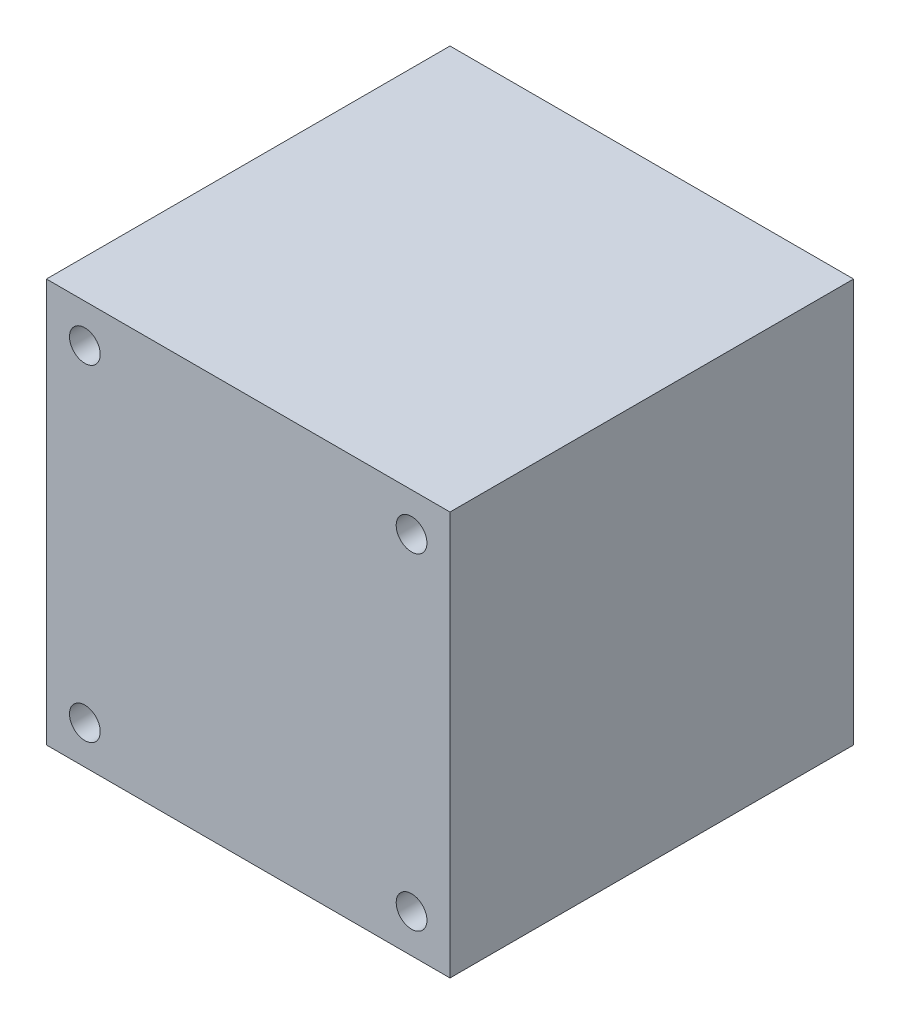
ISO-10303-21;
HEADER;
FILE_DESCRIPTION(('STEP AP214'),'2;1');
FILE_NAME('part.step','',(''),(''),'','','');
FILE_SCHEMA(('AUTOMOTIVE_DESIGN { 1 0 10303 214 1 1 1 1 }'));
ENDSEC;
DATA;
#1=APPLICATION_CONTEXT('core data for automotive mechanical design processes');
#2=APPLICATION_PROTOCOL_DEFINITION('international standard','automotive_design',2000,#1);
#3=PRODUCT_CONTEXT('',#1,'mechanical');
#4=PRODUCT('Part','Part','',(#3));
#5=PRODUCT_RELATED_PRODUCT_CATEGORY('part','',(#4));
#6=PRODUCT_DEFINITION_FORMATION('','',#4);
#7=PRODUCT_DEFINITION_CONTEXT('part definition',#1,'design');
#8=PRODUCT_DEFINITION('design','',#6,#7);
#9=PRODUCT_DEFINITION_SHAPE('','',#8);
#10=(LENGTH_UNIT() NAMED_UNIT(*) SI_UNIT(.MILLI.,.METRE.));
#11=(NAMED_UNIT(*) PLANE_ANGLE_UNIT() SI_UNIT($,.RADIAN.));
#12=(NAMED_UNIT(*) SI_UNIT($,.STERADIAN.) SOLID_ANGLE_UNIT());
#13=UNCERTAINTY_MEASURE_WITH_UNIT(LENGTH_MEASURE(1.E-05),#10,'distance_accuracy_value','');
#14=(GEOMETRIC_REPRESENTATION_CONTEXT(3) GLOBAL_UNCERTAINTY_ASSIGNED_CONTEXT((#13)) GLOBAL_UNIT_ASSIGNED_CONTEXT((#10,
#11,#12)) REPRESENTATION_CONTEXT('',''));
#15=CARTESIAN_POINT('',(0.,0.,0.));
#16=DIRECTION('',(0.,0.,1.));
#17=DIRECTION('',(1.,0.,0.));
#18=AXIS2_PLACEMENT_3D('',#15,#16,#17);
#19=CARTESIAN_POINT('',(0.,0.,42.));
#20=DIRECTION('',(0.,0.,-1.));
#21=DIRECTION('',(-1.,0.,0.));
#22=AXIS2_PLACEMENT_3D('',#19,#20,#21);
#23=PLANE('',#22);
#24=DIRECTION('',(0.,1.,0.));
#25=VECTOR('',#24,1.);
#26=CARTESIAN_POINT('',(21.,-21.,42.));
#27=LINE('',#26,#25);
#28=CARTESIAN_POINT('',(21.,-21.,42.));
#29=VERTEX_POINT('',#28);
#30=CARTESIAN_POINT('',(21.,21.,42.));
#31=VERTEX_POINT('',#30);
#32=EDGE_CURVE('E85',#29,#31,#27,.T.);
#33=ORIENTED_EDGE('',*,*,#32,.T.);
#34=DIRECTION('',(-1.,0.,0.));
#35=VECTOR('',#34,1.);
#36=CARTESIAN_POINT('',(-21.,21.,42.));
#37=LINE('',#36,#35);
#38=CARTESIAN_POINT('',(-21.,21.,42.));
#39=VERTEX_POINT('',#38);
#40=EDGE_CURVE('E80',#31,#39,#37,.T.);
#41=ORIENTED_EDGE('',*,*,#40,.T.);
#42=DIRECTION('',(0.,-1.,0.));
#43=VECTOR('',#42,1.);
#44=CARTESIAN_POINT('',(-21.,-21.,42.));
#45=LINE('',#44,#43);
#46=CARTESIAN_POINT('',(-21.,-21.,42.));
#47=VERTEX_POINT('',#46);
#48=EDGE_CURVE('E83',#39,#47,#45,.T.);
#49=ORIENTED_EDGE('',*,*,#48,.T.);
#50=DIRECTION('',(1.,0.,0.));
#51=VECTOR('',#50,1.);
#52=CARTESIAN_POINT('',(-21.,-21.,42.));
#53=LINE('',#52,#51);
#54=EDGE_CURVE('E50',#47,#29,#53,.T.);
#55=ORIENTED_EDGE('',*,*,#54,.T.);
#56=EDGE_LOOP('',(#33,#41,#49,#55));
#57=FACE_BOUND('',#56,.T.);
#58=CARTESIAN_POINT('',(-17.,17.,42.));
#59=DIRECTION('',(0.,0.,1.));
#60=DIRECTION('',(1.,0.,0.));
#61=AXIS2_PLACEMENT_3D('',#58,#59,#60);
#62=CIRCLE('',#61,1.6);
#63=CARTESIAN_POINT('',(-18.6,17.,42.));
#64=VERTEX_POINT('',#63);
#65=EDGE_CURVE('E100',#64,#64,#62,.T.);
#66=ORIENTED_EDGE('',*,*,#65,.F.);
#67=EDGE_LOOP('',(#66));
#68=FACE_BOUND('',#67,.T.);
#69=CARTESIAN_POINT('',(-17.,-17.,42.));
#70=DIRECTION('',(0.,0.,1.));
#71=DIRECTION('',(1.,0.,0.));
#72=AXIS2_PLACEMENT_3D('',#69,#70,#71);
#73=CIRCLE('',#72,1.6);
#74=CARTESIAN_POINT('',(-18.6,-17.,42.));
#75=VERTEX_POINT('',#74);
#76=EDGE_CURVE('E115',#75,#75,#73,.T.);
#77=ORIENTED_EDGE('',*,*,#76,.F.);
#78=EDGE_LOOP('',(#77));
#79=FACE_BOUND('',#78,.T.);
#80=CARTESIAN_POINT('',(17.,-17.,42.));
#81=DIRECTION('',(0.,0.,1.));
#82=DIRECTION('',(1.,0.,0.));
#83=AXIS2_PLACEMENT_3D('',#80,#81,#82);
#84=CIRCLE('',#83,1.6);
#85=CARTESIAN_POINT('',(15.4,-17.,42.));
#86=VERTEX_POINT('',#85);
#87=EDGE_CURVE('E121',#86,#86,#84,.T.);
#88=ORIENTED_EDGE('',*,*,#87,.F.);
#89=EDGE_LOOP('',(#88));
#90=FACE_BOUND('',#89,.T.);
#91=CARTESIAN_POINT('',(17.,17.,42.));
#92=DIRECTION('',(0.,0.,1.));
#93=DIRECTION('',(1.,0.,0.));
#94=AXIS2_PLACEMENT_3D('',#91,#92,#93);
#95=CIRCLE('',#94,1.6);
#96=CARTESIAN_POINT('',(15.4,17.,42.));
#97=VERTEX_POINT('',#96);
#98=EDGE_CURVE('E127',#97,#97,#95,.T.);
#99=ORIENTED_EDGE('',*,*,#98,.F.);
#100=EDGE_LOOP('',(#99));
#101=FACE_BOUND('',#100,.T.);
#102=ADVANCED_FACE('F33',(#57,#68,#79,#90,#101),#23,.F.);
#103=CARTESIAN_POINT('',(0.,0.,0.));
#104=DIRECTION('',(0.,0.,-1.));
#105=DIRECTION('',(-1.,0.,0.));
#106=AXIS2_PLACEMENT_3D('',#103,#104,#105);
#107=PLANE('',#106);
#108=CARTESIAN_POINT('',(17.,-17.,0.));
#109=DIRECTION('',(0.,0.,1.));
#110=DIRECTION('',(1.,0.,0.));
#111=AXIS2_PLACEMENT_3D('',#108,#109,#110);
#112=CIRCLE('',#111,1.6);
#113=CARTESIAN_POINT('',(15.4,-17.,0.));
#114=VERTEX_POINT('',#113);
#115=EDGE_CURVE('E124',#114,#114,#112,.T.);
#116=ORIENTED_EDGE('',*,*,#115,.T.);
#117=EDGE_LOOP('',(#116));
#118=FACE_BOUND('',#117,.T.);
#119=CARTESIAN_POINT('',(-17.,17.,0.));
#120=DIRECTION('',(0.,0.,1.));
#121=DIRECTION('',(1.,0.,0.));
#122=AXIS2_PLACEMENT_3D('',#119,#120,#121);
#123=CIRCLE('',#122,1.6);
#124=CARTESIAN_POINT('',(-18.6,17.,0.));
#125=VERTEX_POINT('',#124);
#126=EDGE_CURVE('E112',#125,#125,#123,.T.);
#127=ORIENTED_EDGE('',*,*,#126,.T.);
#128=EDGE_LOOP('',(#127));
#129=FACE_BOUND('',#128,.T.);
#130=DIRECTION('',(0.,1.,0.));
#131=VECTOR('',#130,1.);
#132=CARTESIAN_POINT('',(21.,-21.,0.));
#133=LINE('',#132,#131);
#134=CARTESIAN_POINT('',(21.,-21.,0.));
#135=VERTEX_POINT('',#134);
#136=CARTESIAN_POINT('',(21.,21.,0.));
#137=VERTEX_POINT('',#136);
#138=EDGE_CURVE('E97',#135,#137,#133,.T.);
#139=ORIENTED_EDGE('',*,*,#138,.F.);
#140=DIRECTION('',(1.,0.,0.));
#141=VECTOR('',#140,1.);
#142=CARTESIAN_POINT('',(-21.,-21.,0.));
#143=LINE('',#142,#141);
#144=CARTESIAN_POINT('',(-21.,-21.,0.));
#145=VERTEX_POINT('',#144);
#146=EDGE_CURVE('E73',#145,#135,#143,.T.);
#147=ORIENTED_EDGE('',*,*,#146,.F.);
#148=DIRECTION('',(0.,-1.,0.));
#149=VECTOR('',#148,1.);
#150=CARTESIAN_POINT('',(-21.,-21.,0.));
#151=LINE('',#150,#149);
#152=CARTESIAN_POINT('',(-21.,21.,0.));
#153=VERTEX_POINT('',#152);
#154=EDGE_CURVE('E67',#153,#145,#151,.T.);
#155=ORIENTED_EDGE('',*,*,#154,.F.);
#156=DIRECTION('',(-1.,0.,0.));
#157=VECTOR('',#156,1.);
#158=CARTESIAN_POINT('',(-21.,21.,0.));
#159=LINE('',#158,#157);
#160=EDGE_CURVE('E89',#137,#153,#159,.T.);
#161=ORIENTED_EDGE('',*,*,#160,.F.);
#162=EDGE_LOOP('',(#139,#147,#155,#161));
#163=FACE_BOUND('',#162,.T.);
#164=CARTESIAN_POINT('',(-17.,-17.,0.));
#165=DIRECTION('',(0.,0.,1.));
#166=DIRECTION('',(1.,0.,0.));
#167=AXIS2_PLACEMENT_3D('',#164,#165,#166);
#168=CIRCLE('',#167,1.6);
#169=CARTESIAN_POINT('',(-18.6,-17.,0.));
#170=VERTEX_POINT('',#169);
#171=EDGE_CURVE('E118',#170,#170,#168,.T.);
#172=ORIENTED_EDGE('',*,*,#171,.T.);
#173=EDGE_LOOP('',(#172));
#174=FACE_BOUND('',#173,.T.);
#175=CARTESIAN_POINT('',(17.,17.,0.));
#176=DIRECTION('',(0.,0.,1.));
#177=DIRECTION('',(1.,0.,0.));
#178=AXIS2_PLACEMENT_3D('',#175,#176,#177);
#179=CIRCLE('',#178,1.6);
#180=CARTESIAN_POINT('',(15.4,17.,0.));
#181=VERTEX_POINT('',#180);
#182=EDGE_CURVE('E130',#181,#181,#179,.T.);
#183=ORIENTED_EDGE('',*,*,#182,.T.);
#184=EDGE_LOOP('',(#183));
#185=FACE_BOUND('',#184,.T.);
#186=ADVANCED_FACE('F108',(#118,#129,#163,#174,#185),#107,.T.);
#187=CARTESIAN_POINT('',(21.,-21.,42.));
#188=DIRECTION('',(-1.,0.,0.));
#189=DIRECTION('',(0.,-1.,0.));
#190=AXIS2_PLACEMENT_3D('',#187,#188,#189);
#191=PLANE('',#190);
#192=ORIENTED_EDGE('',*,*,#138,.T.);
#193=DIRECTION('',(0.,0.,-1.));
#194=VECTOR('',#193,1.);
#195=CARTESIAN_POINT('',(21.,21.,42.));
#196=LINE('',#195,#194);
#197=EDGE_CURVE('E11',#31,#137,#196,.T.);
#198=ORIENTED_EDGE('',*,*,#197,.F.);
#199=ORIENTED_EDGE('',*,*,#32,.F.);
#200=DIRECTION('',(0.,0.,-1.));
#201=VECTOR('',#200,1.);
#202=CARTESIAN_POINT('',(21.,-21.,42.));
#203=LINE('',#202,#201);
#204=EDGE_CURVE('E93',#29,#135,#203,.T.);
#205=ORIENTED_EDGE('',*,*,#204,.T.);
#206=EDGE_LOOP('',(#192,#198,#199,#205));
#207=FACE_BOUND('',#206,.T.);
#208=ADVANCED_FACE('F35',(#207),#191,.F.);
#209=CARTESIAN_POINT('',(-21.,21.,42.));
#210=DIRECTION('',(0.,-1.,0.));
#211=DIRECTION('',(0.,0.,-1.));
#212=AXIS2_PLACEMENT_3D('',#209,#210,#211);
#213=PLANE('',#212);
#214=ORIENTED_EDGE('',*,*,#160,.T.);
#215=DIRECTION('',(0.,0.,-1.));
#216=VECTOR('',#215,1.);
#217=CARTESIAN_POINT('',(-21.,21.,42.));
#218=LINE('',#217,#216);
#219=EDGE_CURVE('E42',#39,#153,#218,.T.);
#220=ORIENTED_EDGE('',*,*,#219,.F.);
#221=ORIENTED_EDGE('',*,*,#40,.F.);
#222=ORIENTED_EDGE('',*,*,#197,.T.);
#223=EDGE_LOOP('',(#214,#220,#221,#222));
#224=FACE_BOUND('',#223,.T.);
#225=ADVANCED_FACE('F88',(#224),#213,.F.);
#226=CARTESIAN_POINT('',(-21.,-21.,42.));
#227=DIRECTION('',(1.,0.,0.));
#228=DIRECTION('',(0.,0.,-1.));
#229=AXIS2_PLACEMENT_3D('',#226,#227,#228);
#230=PLANE('',#229);
#231=ORIENTED_EDGE('',*,*,#154,.T.);
#232=DIRECTION('',(0.,0.,-1.));
#233=VECTOR('',#232,1.);
#234=CARTESIAN_POINT('',(-21.,-21.,42.));
#235=LINE('',#234,#233);
#236=EDGE_CURVE('E90',#47,#145,#235,.T.);
#237=ORIENTED_EDGE('',*,*,#236,.F.);
#238=ORIENTED_EDGE('',*,*,#48,.F.);
#239=ORIENTED_EDGE('',*,*,#219,.T.);
#240=EDGE_LOOP('',(#231,#237,#238,#239));
#241=FACE_BOUND('',#240,.T.);
#242=ADVANCED_FACE('F91',(#241),#230,.F.);
#243=CARTESIAN_POINT('',(-21.,-21.,42.));
#244=DIRECTION('',(0.,1.,0.));
#245=DIRECTION('',(-1.,0.,0.));
#246=AXIS2_PLACEMENT_3D('',#243,#244,#245);
#247=PLANE('',#246);
#248=ORIENTED_EDGE('',*,*,#146,.T.);
#249=ORIENTED_EDGE('',*,*,#204,.F.);
#250=ORIENTED_EDGE('',*,*,#54,.F.);
#251=ORIENTED_EDGE('',*,*,#236,.T.);
#252=EDGE_LOOP('',(#248,#249,#250,#251));
#253=FACE_BOUND('',#252,.T.);
#254=ADVANCED_FACE('F105',(#253),#247,.F.);
#255=CARTESIAN_POINT('',(-17.,17.,42.));
#256=DIRECTION('',(0.,0.,-1.));
#257=DIRECTION('',(-1.,0.,0.));
#258=AXIS2_PLACEMENT_3D('',#255,#256,#257);
#259=CYLINDRICAL_SURFACE('',#258,1.6);
#260=CARTESIAN_POINT('',(-18.6,17.,42.));
#261=CARTESIAN_POINT('',(-18.6,17.,41.5625));
#262=CARTESIAN_POINT('',(-18.6,17.,41.125));
#263=CARTESIAN_POINT('',(-18.6,17.,40.25));
#264=CARTESIAN_POINT('',(-18.6,17.,39.8125));
#265=CARTESIAN_POINT('',(-18.6,17.,38.9375));
#266=CARTESIAN_POINT('',(-18.6,17.,38.5));
#267=CARTESIAN_POINT('',(-18.6,17.,37.625));
#268=CARTESIAN_POINT('',(-18.6,17.,37.1875));
#269=CARTESIAN_POINT('',(-18.6,17.,36.3125));
#270=CARTESIAN_POINT('',(-18.6,17.,35.875));
#271=CARTESIAN_POINT('',(-18.6,17.,35.));
#272=CARTESIAN_POINT('',(-18.6,17.,34.5625));
#273=CARTESIAN_POINT('',(-18.6,17.,33.6875));
#274=CARTESIAN_POINT('',(-18.6,17.,33.25));
#275=CARTESIAN_POINT('',(-18.6,17.,32.375));
#276=CARTESIAN_POINT('',(-18.6,17.,31.9375));
#277=CARTESIAN_POINT('',(-18.6,17.,31.0625));
#278=CARTESIAN_POINT('',(-18.6,17.,30.625));
#279=CARTESIAN_POINT('',(-18.6,17.,29.75));
#280=CARTESIAN_POINT('',(-18.6,17.,29.3125));
#281=CARTESIAN_POINT('',(-18.6,17.,28.4375));
#282=CARTESIAN_POINT('',(-18.6,17.,28.));
#283=CARTESIAN_POINT('',(-18.6,17.,27.125));
#284=CARTESIAN_POINT('',(-18.6,17.,26.6875));
#285=CARTESIAN_POINT('',(-18.6,17.,25.8125));
#286=CARTESIAN_POINT('',(-18.6,17.,25.375));
#287=CARTESIAN_POINT('',(-18.6,17.,24.5));
#288=CARTESIAN_POINT('',(-18.6,17.,24.0625));
#289=CARTESIAN_POINT('',(-18.6,17.,23.1875));
#290=CARTESIAN_POINT('',(-18.6,17.,22.75));
#291=CARTESIAN_POINT('',(-18.6,17.,21.875));
#292=CARTESIAN_POINT('',(-18.6,17.,21.4375));
#293=CARTESIAN_POINT('',(-18.6,17.,20.5625));
#294=CARTESIAN_POINT('',(-18.6,17.,20.125));
#295=CARTESIAN_POINT('',(-18.6,17.,19.25));
#296=CARTESIAN_POINT('',(-18.6,17.,18.8125));
#297=CARTESIAN_POINT('',(-18.6,17.,17.9375));
#298=CARTESIAN_POINT('',(-18.6,17.,17.5));
#299=CARTESIAN_POINT('',(-18.6,17.,16.625));
#300=CARTESIAN_POINT('',(-18.6,17.,16.1875));
#301=CARTESIAN_POINT('',(-18.6,17.,15.3125));
#302=CARTESIAN_POINT('',(-18.6,17.,14.875));
#303=CARTESIAN_POINT('',(-18.6,17.,14.));
#304=CARTESIAN_POINT('',(-18.6,17.,13.5625));
#305=CARTESIAN_POINT('',(-18.6,17.,12.6875));
#306=CARTESIAN_POINT('',(-18.6,17.,12.25));
#307=CARTESIAN_POINT('',(-18.6,17.,11.375));
#308=CARTESIAN_POINT('',(-18.6,17.,10.9375));
#309=CARTESIAN_POINT('',(-18.6,17.,10.0625));
#310=CARTESIAN_POINT('',(-18.6,17.,9.625));
#311=CARTESIAN_POINT('',(-18.6,17.,8.75));
#312=CARTESIAN_POINT('',(-18.6,17.,8.3125));
#313=CARTESIAN_POINT('',(-18.6,17.,7.4375));
#314=CARTESIAN_POINT('',(-18.6,17.,7.));
#315=CARTESIAN_POINT('',(-18.6,17.,6.125));
#316=CARTESIAN_POINT('',(-18.6,17.,5.6875));
#317=CARTESIAN_POINT('',(-18.6,17.,4.8125));
#318=CARTESIAN_POINT('',(-18.6,17.,4.375));
#319=CARTESIAN_POINT('',(-18.6,17.,3.5));
#320=CARTESIAN_POINT('',(-18.6,17.,3.0625));
#321=CARTESIAN_POINT('',(-18.6,17.,2.1875));
#322=CARTESIAN_POINT('',(-18.6,17.,1.75));
#323=CARTESIAN_POINT('',(-18.6,17.,0.875000000000001));
#324=CARTESIAN_POINT('',(-18.6,17.,0.4375));
#325=CARTESIAN_POINT('',(-18.6,17.,0.));
#326=B_SPLINE_CURVE_WITH_KNOTS('',3,(#260,#261,#262,#263,#264,#265,#266,#267,#268,#269,#270,
#271,#272,#273,#274,#275,#276,#277,#278,#279,#280,#281,#282,#283,#284,#285,#286,#287,#288,#289,
#290,#291,#292,#293,#294,#295,#296,#297,#298,#299,#300,#301,#302,#303,#304,#305,#306,#307,#308,
#309,#310,#311,#312,#313,#314,#315,#316,#317,#318,#319,#320,#321,#322,#323,#324,#325),
.UNSPECIFIED.,.F.,.F.,(4,2,2,2,2,2,2,2,2,2,2,2,2,2,2,2,2,2,2,2,2,2,2,2,2,2,2,2,2,2,2,2,4),(0.,
1.3125,2.625,3.9375,5.25,6.56250000000001,7.875,9.1875,10.5,11.8125,13.125,14.4375,15.75,
17.0625,18.375,19.6875,21.,22.3125,23.625,24.9375,26.25,27.5625,28.875,30.1875,31.5,32.8125,
34.125,35.4375,36.75,38.0625,39.375,40.6875,42.),.UNSPECIFIED.);
#327=EDGE_CURVE('BSEAM147',#64,#125,#326,.T.);
#328=ORIENTED_EDGE('',*,*,#65,.T.);
#329=ORIENTED_EDGE('',*,*,#126,.F.);
#330=ORIENTED_EDGE('',*,*,#327,.T.);
#331=ORIENTED_EDGE('',*,*,#327,.F.);
#332=EDGE_LOOP('',(#328,#330,#329,#331));
#333=FACE_BOUND('',#332,.T.);
#334=ADVANCED_FACE('F147',(#333),#259,.F.);
#335=CARTESIAN_POINT('',(-17.,-17.,42.));
#336=DIRECTION('',(0.,0.,-1.));
#337=DIRECTION('',(-1.,0.,0.));
#338=AXIS2_PLACEMENT_3D('',#335,#336,#337);
#339=CYLINDRICAL_SURFACE('',#338,1.6);
#340=CARTESIAN_POINT('',(-18.6,-17.,42.));
#341=CARTESIAN_POINT('',(-18.6,-17.,41.5625));
#342=CARTESIAN_POINT('',(-18.6,-17.,41.125));
#343=CARTESIAN_POINT('',(-18.6,-17.,40.25));
#344=CARTESIAN_POINT('',(-18.6,-17.,39.8125));
#345=CARTESIAN_POINT('',(-18.6,-17.,38.9375));
#346=CARTESIAN_POINT('',(-18.6,-17.,38.5));
#347=CARTESIAN_POINT('',(-18.6,-17.,37.625));
#348=CARTESIAN_POINT('',(-18.6,-17.,37.1875));
#349=CARTESIAN_POINT('',(-18.6,-17.,36.3125));
#350=CARTESIAN_POINT('',(-18.6,-17.,35.875));
#351=CARTESIAN_POINT('',(-18.6,-17.,35.));
#352=CARTESIAN_POINT('',(-18.6,-17.,34.5625));
#353=CARTESIAN_POINT('',(-18.6,-17.,33.6875));
#354=CARTESIAN_POINT('',(-18.6,-17.,33.25));
#355=CARTESIAN_POINT('',(-18.6,-17.,32.375));
#356=CARTESIAN_POINT('',(-18.6,-17.,31.9375));
#357=CARTESIAN_POINT('',(-18.6,-17.,31.0625));
#358=CARTESIAN_POINT('',(-18.6,-17.,30.625));
#359=CARTESIAN_POINT('',(-18.6,-17.,29.75));
#360=CARTESIAN_POINT('',(-18.6,-17.,29.3125));
#361=CARTESIAN_POINT('',(-18.6,-17.,28.4375));
#362=CARTESIAN_POINT('',(-18.6,-17.,28.));
#363=CARTESIAN_POINT('',(-18.6,-17.,27.125));
#364=CARTESIAN_POINT('',(-18.6,-17.,26.6875));
#365=CARTESIAN_POINT('',(-18.6,-17.,25.8125));
#366=CARTESIAN_POINT('',(-18.6,-17.,25.375));
#367=CARTESIAN_POINT('',(-18.6,-17.,24.5));
#368=CARTESIAN_POINT('',(-18.6,-17.,24.0625));
#369=CARTESIAN_POINT('',(-18.6,-17.,23.1875));
#370=CARTESIAN_POINT('',(-18.6,-17.,22.75));
#371=CARTESIAN_POINT('',(-18.6,-17.,21.875));
#372=CARTESIAN_POINT('',(-18.6,-17.,21.4375));
#373=CARTESIAN_POINT('',(-18.6,-17.,20.5625));
#374=CARTESIAN_POINT('',(-18.6,-17.,20.125));
#375=CARTESIAN_POINT('',(-18.6,-17.,19.25));
#376=CARTESIAN_POINT('',(-18.6,-17.,18.8125));
#377=CARTESIAN_POINT('',(-18.6,-17.,17.9375));
#378=CARTESIAN_POINT('',(-18.6,-17.,17.5));
#379=CARTESIAN_POINT('',(-18.6,-17.,16.625));
#380=CARTESIAN_POINT('',(-18.6,-17.,16.1875));
#381=CARTESIAN_POINT('',(-18.6,-17.,15.3125));
#382=CARTESIAN_POINT('',(-18.6,-17.,14.875));
#383=CARTESIAN_POINT('',(-18.6,-17.,14.));
#384=CARTESIAN_POINT('',(-18.6,-17.,13.5625));
#385=CARTESIAN_POINT('',(-18.6,-17.,12.6875));
#386=CARTESIAN_POINT('',(-18.6,-17.,12.25));
#387=CARTESIAN_POINT('',(-18.6,-17.,11.375));
#388=CARTESIAN_POINT('',(-18.6,-17.,10.9375));
#389=CARTESIAN_POINT('',(-18.6,-17.,10.0625));
#390=CARTESIAN_POINT('',(-18.6,-17.,9.625));
#391=CARTESIAN_POINT('',(-18.6,-17.,8.75));
#392=CARTESIAN_POINT('',(-18.6,-17.,8.3125));
#393=CARTESIAN_POINT('',(-18.6,-17.,7.4375));
#394=CARTESIAN_POINT('',(-18.6,-17.,7.));
#395=CARTESIAN_POINT('',(-18.6,-17.,6.125));
#396=CARTESIAN_POINT('',(-18.6,-17.,5.6875));
#397=CARTESIAN_POINT('',(-18.6,-17.,4.8125));
#398=CARTESIAN_POINT('',(-18.6,-17.,4.375));
#399=CARTESIAN_POINT('',(-18.6,-17.,3.5));
#400=CARTESIAN_POINT('',(-18.6,-17.,3.0625));
#401=CARTESIAN_POINT('',(-18.6,-17.,2.1875));
#402=CARTESIAN_POINT('',(-18.6,-17.,1.75));
#403=CARTESIAN_POINT('',(-18.6,-17.,0.875000000000001));
#404=CARTESIAN_POINT('',(-18.6,-17.,0.4375));
#405=CARTESIAN_POINT('',(-18.6,-17.,0.));
#406=B_SPLINE_CURVE_WITH_KNOTS('',3,(#340,#341,#342,#343,#344,#345,#346,#347,#348,#349,#350,
#351,#352,#353,#354,#355,#356,#357,#358,#359,#360,#361,#362,#363,#364,#365,#366,#367,#368,#369,
#370,#371,#372,#373,#374,#375,#376,#377,#378,#379,#380,#381,#382,#383,#384,#385,#386,#387,#388,
#389,#390,#391,#392,#393,#394,#395,#396,#397,#398,#399,#400,#401,#402,#403,#404,#405),
.UNSPECIFIED.,.F.,.F.,(4,2,2,2,2,2,2,2,2,2,2,2,2,2,2,2,2,2,2,2,2,2,2,2,2,2,2,2,2,2,2,2,4),(0.,
1.3125,2.625,3.9375,5.25,6.56250000000001,7.875,9.1875,10.5,11.8125,13.125,14.4375,15.75,
17.0625,18.375,19.6875,21.,22.3125,23.625,24.9375,26.25,27.5625,28.875,30.1875,31.5,32.8125,
34.125,35.4375,36.75,38.0625,39.375,40.6875,42.),.UNSPECIFIED.);
#407=EDGE_CURVE('BSEAM193',#75,#170,#406,.T.);
#408=ORIENTED_EDGE('',*,*,#76,.T.);
#409=ORIENTED_EDGE('',*,*,#171,.F.);
#410=ORIENTED_EDGE('',*,*,#407,.T.);
#411=ORIENTED_EDGE('',*,*,#407,.F.);
#412=EDGE_LOOP('',(#408,#410,#409,#411));
#413=FACE_BOUND('',#412,.T.);
#414=ADVANCED_FACE('F193',(#413),#339,.F.);
#415=CARTESIAN_POINT('',(17.,-17.,42.));
#416=DIRECTION('',(0.,0.,-1.));
#417=DIRECTION('',(-1.,0.,0.));
#418=AXIS2_PLACEMENT_3D('',#415,#416,#417);
#419=CYLINDRICAL_SURFACE('',#418,1.6);
#420=CARTESIAN_POINT('',(15.4,-17.,42.));
#421=CARTESIAN_POINT('',(15.4,-17.,41.5625));
#422=CARTESIAN_POINT('',(15.4,-17.,41.125));
#423=CARTESIAN_POINT('',(15.4,-17.,40.25));
#424=CARTESIAN_POINT('',(15.4,-17.,39.8125));
#425=CARTESIAN_POINT('',(15.4,-17.,38.9375));
#426=CARTESIAN_POINT('',(15.4,-17.,38.5));
#427=CARTESIAN_POINT('',(15.4,-17.,37.625));
#428=CARTESIAN_POINT('',(15.4,-17.,37.1875));
#429=CARTESIAN_POINT('',(15.4,-17.,36.3125));
#430=CARTESIAN_POINT('',(15.4,-17.,35.875));
#431=CARTESIAN_POINT('',(15.4,-17.,35.));
#432=CARTESIAN_POINT('',(15.4,-17.,34.5625));
#433=CARTESIAN_POINT('',(15.4,-17.,33.6875));
#434=CARTESIAN_POINT('',(15.4,-17.,33.25));
#435=CARTESIAN_POINT('',(15.4,-17.,32.375));
#436=CARTESIAN_POINT('',(15.4,-17.,31.9375));
#437=CARTESIAN_POINT('',(15.4,-17.,31.0625));
#438=CARTESIAN_POINT('',(15.4,-17.,30.625));
#439=CARTESIAN_POINT('',(15.4,-17.,29.75));
#440=CARTESIAN_POINT('',(15.4,-17.,29.3125));
#441=CARTESIAN_POINT('',(15.4,-17.,28.4375));
#442=CARTESIAN_POINT('',(15.4,-17.,28.));
#443=CARTESIAN_POINT('',(15.4,-17.,27.125));
#444=CARTESIAN_POINT('',(15.4,-17.,26.6875));
#445=CARTESIAN_POINT('',(15.4,-17.,25.8125));
#446=CARTESIAN_POINT('',(15.4,-17.,25.375));
#447=CARTESIAN_POINT('',(15.4,-17.,24.5));
#448=CARTESIAN_POINT('',(15.4,-17.,24.0625));
#449=CARTESIAN_POINT('',(15.4,-17.,23.1875));
#450=CARTESIAN_POINT('',(15.4,-17.,22.75));
#451=CARTESIAN_POINT('',(15.4,-17.,21.875));
#452=CARTESIAN_POINT('',(15.4,-17.,21.4375));
#453=CARTESIAN_POINT('',(15.4,-17.,20.5625));
#454=CARTESIAN_POINT('',(15.4,-17.,20.125));
#455=CARTESIAN_POINT('',(15.4,-17.,19.25));
#456=CARTESIAN_POINT('',(15.4,-17.,18.8125));
#457=CARTESIAN_POINT('',(15.4,-17.,17.9375));
#458=CARTESIAN_POINT('',(15.4,-17.,17.5));
#459=CARTESIAN_POINT('',(15.4,-17.,16.625));
#460=CARTESIAN_POINT('',(15.4,-17.,16.1875));
#461=CARTESIAN_POINT('',(15.4,-17.,15.3125));
#462=CARTESIAN_POINT('',(15.4,-17.,14.875));
#463=CARTESIAN_POINT('',(15.4,-17.,14.));
#464=CARTESIAN_POINT('',(15.4,-17.,13.5625));
#465=CARTESIAN_POINT('',(15.4,-17.,12.6875));
#466=CARTESIAN_POINT('',(15.4,-17.,12.25));
#467=CARTESIAN_POINT('',(15.4,-17.,11.375));
#468=CARTESIAN_POINT('',(15.4,-17.,10.9375));
#469=CARTESIAN_POINT('',(15.4,-17.,10.0625));
#470=CARTESIAN_POINT('',(15.4,-17.,9.625));
#471=CARTESIAN_POINT('',(15.4,-17.,8.75));
#472=CARTESIAN_POINT('',(15.4,-17.,8.3125));
#473=CARTESIAN_POINT('',(15.4,-17.,7.4375));
#474=CARTESIAN_POINT('',(15.4,-17.,7.));
#475=CARTESIAN_POINT('',(15.4,-17.,6.125));
#476=CARTESIAN_POINT('',(15.4,-17.,5.6875));
#477=CARTESIAN_POINT('',(15.4,-17.,4.8125));
#478=CARTESIAN_POINT('',(15.4,-17.,4.375));
#479=CARTESIAN_POINT('',(15.4,-17.,3.5));
#480=CARTESIAN_POINT('',(15.4,-17.,3.0625));
#481=CARTESIAN_POINT('',(15.4,-17.,2.1875));
#482=CARTESIAN_POINT('',(15.4,-17.,1.75));
#483=CARTESIAN_POINT('',(15.4,-17.,0.875000000000001));
#484=CARTESIAN_POINT('',(15.4,-17.,0.4375));
#485=CARTESIAN_POINT('',(15.4,-17.,0.));
#486=B_SPLINE_CURVE_WITH_KNOTS('',3,(#420,#421,#422,#423,#424,#425,#426,#427,#428,#429,#430,
#431,#432,#433,#434,#435,#436,#437,#438,#439,#440,#441,#442,#443,#444,#445,#446,#447,#448,#449,
#450,#451,#452,#453,#454,#455,#456,#457,#458,#459,#460,#461,#462,#463,#464,#465,#466,#467,#468,
#469,#470,#471,#472,#473,#474,#475,#476,#477,#478,#479,#480,#481,#482,#483,#484,#485),
.UNSPECIFIED.,.F.,.F.,(4,2,2,2,2,2,2,2,2,2,2,2,2,2,2,2,2,2,2,2,2,2,2,2,2,2,2,2,2,2,2,2,4),(0.,
1.3125,2.625,3.9375,5.25,6.56250000000001,7.875,9.1875,10.5,11.8125,13.125,14.4375,15.75,
17.0625,18.375,19.6875,21.,22.3125,23.625,24.9375,26.25,27.5625,28.875,30.1875,31.5,32.8125,
34.125,35.4375,36.75,38.0625,39.375,40.6875,42.),.UNSPECIFIED.);
#487=EDGE_CURVE('BSEAM201',#86,#114,#486,.T.);
#488=ORIENTED_EDGE('',*,*,#87,.T.);
#489=ORIENTED_EDGE('',*,*,#115,.F.);
#490=ORIENTED_EDGE('',*,*,#487,.T.);
#491=ORIENTED_EDGE('',*,*,#487,.F.);
#492=EDGE_LOOP('',(#488,#490,#489,#491));
#493=FACE_BOUND('',#492,.T.);
#494=ADVANCED_FACE('F201',(#493),#419,.F.);
#495=CARTESIAN_POINT('',(17.,17.,42.));
#496=DIRECTION('',(0.,0.,-1.));
#497=DIRECTION('',(-1.,0.,0.));
#498=AXIS2_PLACEMENT_3D('',#495,#496,#497);
#499=CYLINDRICAL_SURFACE('',#498,1.6);
#500=CARTESIAN_POINT('',(15.4,17.,42.));
#501=CARTESIAN_POINT('',(15.4,17.,41.5625));
#502=CARTESIAN_POINT('',(15.4,17.,41.125));
#503=CARTESIAN_POINT('',(15.4,17.,40.25));
#504=CARTESIAN_POINT('',(15.4,17.,39.8125));
#505=CARTESIAN_POINT('',(15.4,17.,38.9375));
#506=CARTESIAN_POINT('',(15.4,17.,38.5));
#507=CARTESIAN_POINT('',(15.4,17.,37.625));
#508=CARTESIAN_POINT('',(15.4,17.,37.1875));
#509=CARTESIAN_POINT('',(15.4,17.,36.3125));
#510=CARTESIAN_POINT('',(15.4,17.,35.875));
#511=CARTESIAN_POINT('',(15.4,17.,35.));
#512=CARTESIAN_POINT('',(15.4,17.,34.5625));
#513=CARTESIAN_POINT('',(15.4,17.,33.6875));
#514=CARTESIAN_POINT('',(15.4,17.,33.25));
#515=CARTESIAN_POINT('',(15.4,17.,32.375));
#516=CARTESIAN_POINT('',(15.4,17.,31.9375));
#517=CARTESIAN_POINT('',(15.4,17.,31.0625));
#518=CARTESIAN_POINT('',(15.4,17.,30.625));
#519=CARTESIAN_POINT('',(15.4,17.,29.75));
#520=CARTESIAN_POINT('',(15.4,17.,29.3125));
#521=CARTESIAN_POINT('',(15.4,17.,28.4375));
#522=CARTESIAN_POINT('',(15.4,17.,28.));
#523=CARTESIAN_POINT('',(15.4,17.,27.125));
#524=CARTESIAN_POINT('',(15.4,17.,26.6875));
#525=CARTESIAN_POINT('',(15.4,17.,25.8125));
#526=CARTESIAN_POINT('',(15.4,17.,25.375));
#527=CARTESIAN_POINT('',(15.4,17.,24.5));
#528=CARTESIAN_POINT('',(15.4,17.,24.0625));
#529=CARTESIAN_POINT('',(15.4,17.,23.1875));
#530=CARTESIAN_POINT('',(15.4,17.,22.75));
#531=CARTESIAN_POINT('',(15.4,17.,21.875));
#532=CARTESIAN_POINT('',(15.4,17.,21.4375));
#533=CARTESIAN_POINT('',(15.4,17.,20.5625));
#534=CARTESIAN_POINT('',(15.4,17.,20.125));
#535=CARTESIAN_POINT('',(15.4,17.,19.25));
#536=CARTESIAN_POINT('',(15.4,17.,18.8125));
#537=CARTESIAN_POINT('',(15.4,17.,17.9375));
#538=CARTESIAN_POINT('',(15.4,17.,17.5));
#539=CARTESIAN_POINT('',(15.4,17.,16.625));
#540=CARTESIAN_POINT('',(15.4,17.,16.1875));
#541=CARTESIAN_POINT('',(15.4,17.,15.3125));
#542=CARTESIAN_POINT('',(15.4,17.,14.875));
#543=CARTESIAN_POINT('',(15.4,17.,14.));
#544=CARTESIAN_POINT('',(15.4,17.,13.5625));
#545=CARTESIAN_POINT('',(15.4,17.,12.6875));
#546=CARTESIAN_POINT('',(15.4,17.,12.25));
#547=CARTESIAN_POINT('',(15.4,17.,11.375));
#548=CARTESIAN_POINT('',(15.4,17.,10.9375));
#549=CARTESIAN_POINT('',(15.4,17.,10.0625));
#550=CARTESIAN_POINT('',(15.4,17.,9.625));
#551=CARTESIAN_POINT('',(15.4,17.,8.75));
#552=CARTESIAN_POINT('',(15.4,17.,8.3125));
#553=CARTESIAN_POINT('',(15.4,17.,7.4375));
#554=CARTESIAN_POINT('',(15.4,17.,7.));
#555=CARTESIAN_POINT('',(15.4,17.,6.125));
#556=CARTESIAN_POINT('',(15.4,17.,5.6875));
#557=CARTESIAN_POINT('',(15.4,17.,4.8125));
#558=CARTESIAN_POINT('',(15.4,17.,4.375));
#559=CARTESIAN_POINT('',(15.4,17.,3.5));
#560=CARTESIAN_POINT('',(15.4,17.,3.0625));
#561=CARTESIAN_POINT('',(15.4,17.,2.1875));
#562=CARTESIAN_POINT('',(15.4,17.,1.75));
#563=CARTESIAN_POINT('',(15.4,17.,0.875000000000001));
#564=CARTESIAN_POINT('',(15.4,17.,0.4375));
#565=CARTESIAN_POINT('',(15.4,17.,0.));
#566=B_SPLINE_CURVE_WITH_KNOTS('',3,(#500,#501,#502,#503,#504,#505,#506,#507,#508,#509,#510,
#511,#512,#513,#514,#515,#516,#517,#518,#519,#520,#521,#522,#523,#524,#525,#526,#527,#528,#529,
#530,#531,#532,#533,#534,#535,#536,#537,#538,#539,#540,#541,#542,#543,#544,#545,#546,#547,#548,
#549,#550,#551,#552,#553,#554,#555,#556,#557,#558,#559,#560,#561,#562,#563,#564,#565),
.UNSPECIFIED.,.F.,.F.,(4,2,2,2,2,2,2,2,2,2,2,2,2,2,2,2,2,2,2,2,2,2,2,2,2,2,2,2,2,2,2,2,4),(0.,
1.3125,2.625,3.9375,5.25,6.56250000000001,7.875,9.1875,10.5,11.8125,13.125,14.4375,15.75,
17.0625,18.375,19.6875,21.,22.3125,23.625,24.9375,26.25,27.5625,28.875,30.1875,31.5,32.8125,
34.125,35.4375,36.75,38.0625,39.375,40.6875,42.),.UNSPECIFIED.);
#567=EDGE_CURVE('BSEAM136',#97,#181,#566,.T.);
#568=ORIENTED_EDGE('',*,*,#98,.T.);
#569=ORIENTED_EDGE('',*,*,#182,.F.);
#570=ORIENTED_EDGE('',*,*,#567,.T.);
#571=ORIENTED_EDGE('',*,*,#567,.F.);
#572=EDGE_LOOP('',(#568,#570,#569,#571));
#573=FACE_BOUND('',#572,.T.);
#574=ADVANCED_FACE('F136',(#573),#499,.F.);
#575=CLOSED_SHELL('',(#102,#186,#208,#225,#242,#254,#334,#414,#494,#574));
#576=MANIFOLD_SOLID_BREP('B2',#575);
#577=ADVANCED_BREP_SHAPE_REPRESENTATION('',(#18,#576),#14);
#578=SHAPE_DEFINITION_REPRESENTATION(#9,#577);
ENDSEC;
END-ISO-10303-21;
